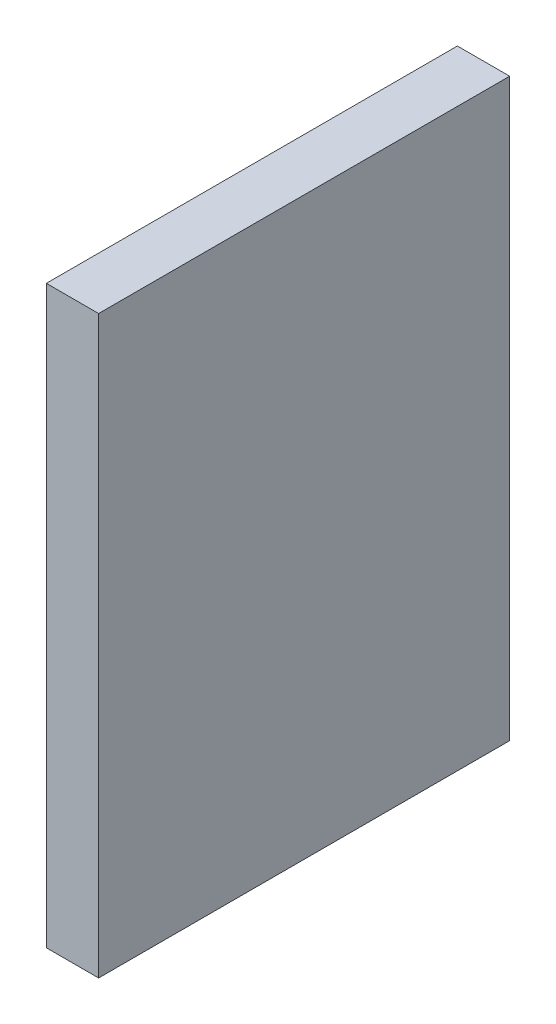
ISO-10303-21;
HEADER;
FILE_DESCRIPTION(('STEP AP214'),'2;1');
FILE_NAME('part.step','',(''),(''),'','','');
FILE_SCHEMA(('AUTOMOTIVE_DESIGN { 1 0 10303 214 1 1 1 1 }'));
ENDSEC;
DATA;
#1=APPLICATION_CONTEXT('core data for automotive mechanical design processes');
#2=APPLICATION_PROTOCOL_DEFINITION('international standard','automotive_design',2000,#1);
#3=PRODUCT_CONTEXT('',#1,'mechanical');
#4=PRODUCT('Part','Part','',(#3));
#5=PRODUCT_RELATED_PRODUCT_CATEGORY('part','',(#4));
#6=PRODUCT_DEFINITION_FORMATION('','',#4);
#7=PRODUCT_DEFINITION_CONTEXT('part definition',#1,'design');
#8=PRODUCT_DEFINITION('design','',#6,#7);
#9=PRODUCT_DEFINITION_SHAPE('','',#8);
#10=(LENGTH_UNIT() NAMED_UNIT(*) SI_UNIT(.MILLI.,.METRE.));
#11=(NAMED_UNIT(*) PLANE_ANGLE_UNIT() SI_UNIT($,.RADIAN.));
#12=(NAMED_UNIT(*) SI_UNIT($,.STERADIAN.) SOLID_ANGLE_UNIT());
#13=UNCERTAINTY_MEASURE_WITH_UNIT(LENGTH_MEASURE(1.E-05),#10,'distance_accuracy_value','');
#14=(GEOMETRIC_REPRESENTATION_CONTEXT(3) GLOBAL_UNCERTAINTY_ASSIGNED_CONTEXT((#13)) GLOBAL_UNIT_ASSIGNED_CONTEXT((#10,
#11,#12)) REPRESENTATION_CONTEXT('',''));
#15=CARTESIAN_POINT('',(0.,0.,0.));
#16=DIRECTION('',(0.,0.,1.));
#17=DIRECTION('',(1.,0.,0.));
#18=AXIS2_PLACEMENT_3D('',#15,#16,#17);
#19=CARTESIAN_POINT('',(-8.69872941707089,19.,5.));
#20=DIRECTION('',(0.,0.,-1.));
#21=DIRECTION('',(-1.,0.,0.));
#22=AXIS2_PLACEMENT_3D('',#19,#20,#21);
#23=PLANE('',#22);
#24=DIRECTION('',(0.,1.,0.));
#25=VECTOR('',#24,1.);
#26=CARTESIAN_POINT('',(50.0987294170709,19.,5.));
#27=LINE('',#26,#25);
#28=CARTESIAN_POINT('',(50.0987294170709,0.,5.));
#29=VERTEX_POINT('',#28);
#30=CARTESIAN_POINT('',(50.0987294170709,7.,5.));
#31=VERTEX_POINT('',#30);
#32=EDGE_CURVE('E86',#29,#31,#27,.T.);
#33=ORIENTED_EDGE('',*,*,#32,.T.);
#34=DIRECTION('',(1.,0.,0.));
#35=VECTOR('',#34,1.);
#36=CARTESIAN_POINT('',(49.4625763163858,7.,5.));
#37=LINE('',#36,#35);
#38=CARTESIAN_POINT('',(49.4625763163858,7.,5.));
#39=VERTEX_POINT('',#38);
#40=EDGE_CURVE('E80',#39,#31,#37,.T.);
#41=ORIENTED_EDGE('',*,*,#40,.F.);
#42=DIRECTION('',(0.,1.,0.));
#43=VECTOR('',#42,1.);
#44=CARTESIAN_POINT('',(49.4625763163858,3.0026050554274,5.));
#45=LINE('',#44,#43);
#46=CARTESIAN_POINT('',(49.4625763163858,0.,5.));
#47=VERTEX_POINT('',#46);
#48=EDGE_CURVE('E75',#47,#39,#45,.T.);
#49=ORIENTED_EDGE('',*,*,#48,.F.);
#50=DIRECTION('',(1.,0.,0.));
#51=VECTOR('',#50,1.);
#52=CARTESIAN_POINT('',(36.4,0.,5.));
#53=LINE('',#52,#51);
#54=EDGE_CURVE('E56',#47,#29,#53,.T.);
#55=ORIENTED_EDGE('',*,*,#54,.T.);
#56=EDGE_LOOP('',(#33,#41,#49,#55));
#57=FACE_BOUND('',#56,.T.);
#58=ADVANCED_FACE('F33',(#57),#23,.F.);
#59=CARTESIAN_POINT('',(-8.69872941707089,19.,0.));
#60=DIRECTION('',(0.,0.,-1.));
#61=DIRECTION('',(-1.,0.,0.));
#62=AXIS2_PLACEMENT_3D('',#59,#60,#61);
#63=PLANE('',#62);
#64=DIRECTION('',(-1.,0.,0.));
#65=VECTOR('',#64,1.);
#66=CARTESIAN_POINT('',(-8.69872941707089,7.,0.));
#67=LINE('',#66,#65);
#68=CARTESIAN_POINT('',(50.0987294170709,7.,0.));
#69=VERTEX_POINT('',#68);
#70=CARTESIAN_POINT('',(49.4625763163858,7.,0.));
#71=VERTEX_POINT('',#70);
#72=EDGE_CURVE('E11',#69,#71,#67,.T.);
#73=ORIENTED_EDGE('',*,*,#72,.F.);
#74=DIRECTION('',(0.,1.,0.));
#75=VECTOR('',#74,1.);
#76=CARTESIAN_POINT('',(50.0987294170709,19.,0.));
#77=LINE('',#76,#75);
#78=CARTESIAN_POINT('',(50.0987294170709,0.,0.));
#79=VERTEX_POINT('',#78);
#80=EDGE_CURVE('E87',#79,#69,#77,.T.);
#81=ORIENTED_EDGE('',*,*,#80,.F.);
#82=DIRECTION('',(1.,0.,0.));
#83=VECTOR('',#82,1.);
#84=CARTESIAN_POINT('',(36.4,0.,0.));
#85=LINE('',#84,#83);
#86=CARTESIAN_POINT('',(49.4625763163858,0.,0.));
#87=VERTEX_POINT('',#86);
#88=EDGE_CURVE('E91',#87,#79,#85,.T.);
#89=ORIENTED_EDGE('',*,*,#88,.F.);
#90=DIRECTION('',(0.,-1.,0.));
#91=VECTOR('',#90,1.);
#92=CARTESIAN_POINT('',(49.4625763163858,19.,0.));
#93=LINE('',#92,#91);
#94=EDGE_CURVE('E41',#71,#87,#93,.T.);
#95=ORIENTED_EDGE('',*,*,#94,.F.);
#96=EDGE_LOOP('',(#73,#81,#89,#95));
#97=FACE_BOUND('',#96,.T.);
#98=ADVANCED_FACE('F103',(#97),#63,.T.);
#99=CARTESIAN_POINT('',(50.0987294170709,19.,5.));
#100=DIRECTION('',(-1.,0.,0.));
#101=DIRECTION('',(0.,-1.,0.));
#102=AXIS2_PLACEMENT_3D('',#99,#100,#101);
#103=PLANE('',#102);
#104=ORIENTED_EDGE('',*,*,#80,.T.);
#105=DIRECTION('',(0.,0.,1.));
#106=VECTOR('',#105,1.);
#107=CARTESIAN_POINT('',(50.0987294170709,7.,5.));
#108=LINE('',#107,#106);
#109=EDGE_CURVE('E94',#69,#31,#108,.T.);
#110=ORIENTED_EDGE('',*,*,#109,.T.);
#111=ORIENTED_EDGE('',*,*,#32,.F.);
#112=DIRECTION('',(0.,0.,-1.));
#113=VECTOR('',#112,1.);
#114=CARTESIAN_POINT('',(50.0987294170709,0.,5.));
#115=LINE('',#114,#113);
#116=EDGE_CURVE('E84',#29,#79,#115,.T.);
#117=ORIENTED_EDGE('',*,*,#116,.T.);
#118=EDGE_LOOP('',(#104,#110,#111,#117));
#119=FACE_BOUND('',#118,.T.);
#120=ADVANCED_FACE('F99',(#119),#103,.F.);
#121=CARTESIAN_POINT('',(36.4,0.,5.));
#122=DIRECTION('',(0.,1.,0.));
#123=DIRECTION('',(-1.,0.,0.));
#124=AXIS2_PLACEMENT_3D('',#121,#122,#123);
#125=PLANE('',#124);
#126=ORIENTED_EDGE('',*,*,#54,.F.);
#127=DIRECTION('',(0.,0.,1.));
#128=VECTOR('',#127,1.);
#129=CARTESIAN_POINT('',(49.4625763163858,0.,-25.));
#130=LINE('',#129,#128);
#131=EDGE_CURVE('E73',#87,#47,#130,.T.);
#132=ORIENTED_EDGE('',*,*,#131,.F.);
#133=ORIENTED_EDGE('',*,*,#88,.T.);
#134=ORIENTED_EDGE('',*,*,#116,.F.);
#135=EDGE_LOOP('',(#126,#132,#133,#134));
#136=FACE_BOUND('',#135,.T.);
#137=ADVANCED_FACE('F35',(#136),#125,.F.);
#138=CARTESIAN_POINT('',(49.4625763163858,3.0026050554274,-25.));
#139=DIRECTION('',(1.,0.,0.));
#140=DIRECTION('',(0.,0.,-1.));
#141=AXIS2_PLACEMENT_3D('',#138,#139,#140);
#142=PLANE('',#141);
#143=ORIENTED_EDGE('',*,*,#94,.T.);
#144=ORIENTED_EDGE('',*,*,#131,.T.);
#145=ORIENTED_EDGE('',*,*,#48,.T.);
#146=DIRECTION('',(0.,0.,1.));
#147=VECTOR('',#146,1.);
#148=CARTESIAN_POINT('',(49.4625763163858,7.,-25.));
#149=LINE('',#148,#147);
#150=EDGE_CURVE('E48',#71,#39,#149,.T.);
#151=ORIENTED_EDGE('',*,*,#150,.F.);
#152=EDGE_LOOP('',(#143,#144,#145,#151));
#153=FACE_BOUND('',#152,.T.);
#154=ADVANCED_FACE('F74',(#153),#142,.F.);
#155=CARTESIAN_POINT('',(49.4625763163858,7.,-25.));
#156=DIRECTION('',(0.,-1.,0.));
#157=DIRECTION('',(0.,0.,-1.));
#158=AXIS2_PLACEMENT_3D('',#155,#156,#157);
#159=PLANE('',#158);
#160=ORIENTED_EDGE('',*,*,#72,.T.);
#161=ORIENTED_EDGE('',*,*,#150,.T.);
#162=ORIENTED_EDGE('',*,*,#40,.T.);
#163=ORIENTED_EDGE('',*,*,#109,.F.);
#164=EDGE_LOOP('',(#160,#161,#162,#163));
#165=FACE_BOUND('',#164,.T.);
#166=ADVANCED_FACE('F105',(#165),#159,.F.);
#167=CLOSED_SHELL('',(#58,#98,#120,#137,#154,#166));
#168=MANIFOLD_SOLID_BREP('B2',#167);
#169=ADVANCED_BREP_SHAPE_REPRESENTATION('',(#18,#168),#14);
#170=SHAPE_DEFINITION_REPRESENTATION(#9,#169);
ENDSEC;
END-ISO-10303-21;
